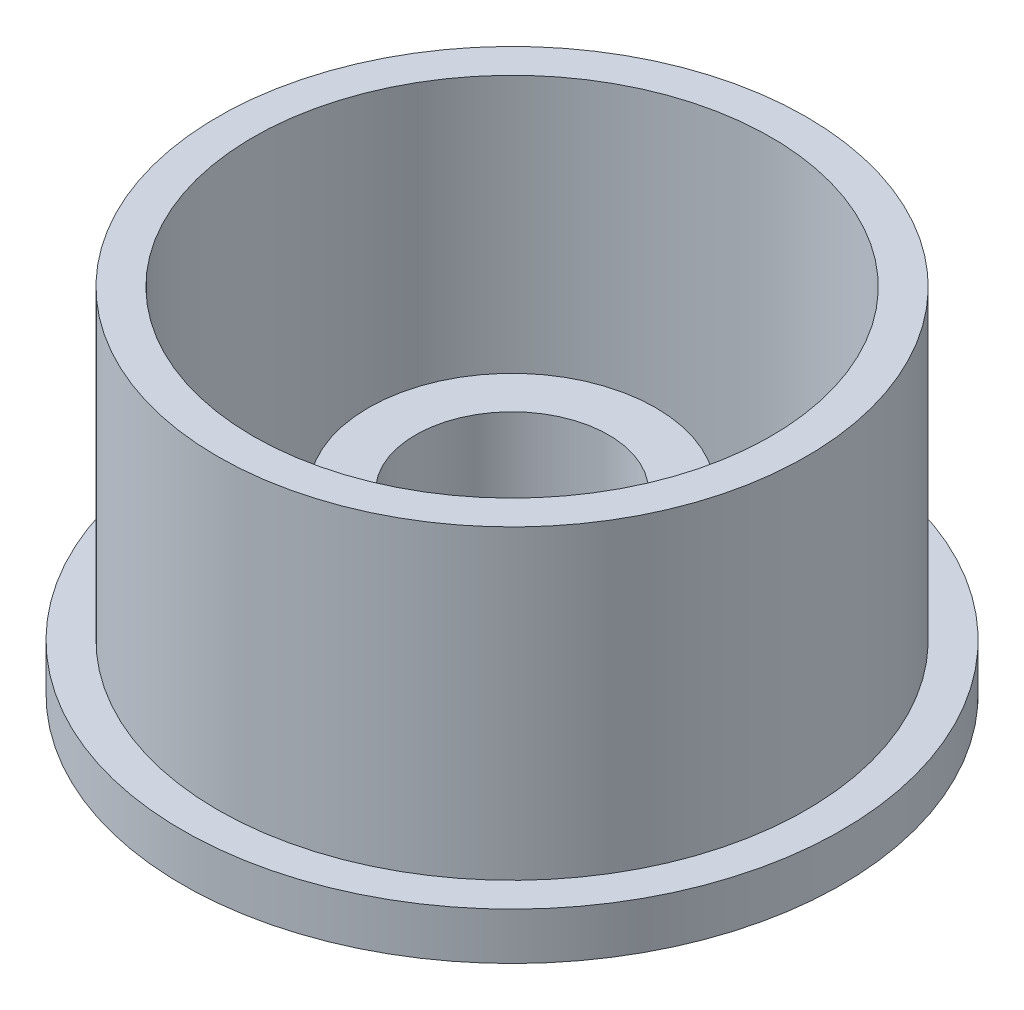
ISO-10303-21;
HEADER;
FILE_DESCRIPTION(('STEP AP214'),'2;1');
FILE_NAME('part.step','',(''),(''),'','','');
FILE_SCHEMA(('AUTOMOTIVE_DESIGN { 1 0 10303 214 1 1 1 1 }'));
ENDSEC;
DATA;
#1=APPLICATION_CONTEXT('core data for automotive mechanical design processes');
#2=APPLICATION_PROTOCOL_DEFINITION('international standard','automotive_design',2000,#1);
#3=PRODUCT_CONTEXT('',#1,'mechanical');
#4=PRODUCT('Part','Part','',(#3));
#5=PRODUCT_RELATED_PRODUCT_CATEGORY('part','',(#4));
#6=PRODUCT_DEFINITION_FORMATION('','',#4);
#7=PRODUCT_DEFINITION_CONTEXT('part definition',#1,'design');
#8=PRODUCT_DEFINITION('design','',#6,#7);
#9=PRODUCT_DEFINITION_SHAPE('','',#8);
#10=(LENGTH_UNIT() NAMED_UNIT(*) SI_UNIT(.MILLI.,.METRE.));
#11=(NAMED_UNIT(*) PLANE_ANGLE_UNIT() SI_UNIT($,.RADIAN.));
#12=(NAMED_UNIT(*) SI_UNIT($,.STERADIAN.) SOLID_ANGLE_UNIT());
#13=UNCERTAINTY_MEASURE_WITH_UNIT(LENGTH_MEASURE(1.E-05),#10,'distance_accuracy_value','');
#14=(GEOMETRIC_REPRESENTATION_CONTEXT(3) GLOBAL_UNCERTAINTY_ASSIGNED_CONTEXT((#13)) GLOBAL_UNIT_ASSIGNED_CONTEXT((#10,
#11,#12)) REPRESENTATION_CONTEXT('',''));
#15=CARTESIAN_POINT('',(0.,0.,0.));
#16=DIRECTION('',(0.,0.,1.));
#17=DIRECTION('',(1.,0.,0.));
#18=AXIS2_PLACEMENT_3D('',#15,#16,#17);
#19=CARTESIAN_POINT('',(0.,15.,0.));
#20=DIRECTION('',(0.,-1.,0.));
#21=DIRECTION('',(0.,0.,-1.));
#22=AXIS2_PLACEMENT_3D('',#19,#20,#21);
#23=CYLINDRICAL_SURFACE('',#22,12.5);
#24=CARTESIAN_POINT('',(0.,15.,0.));
#25=DIRECTION('',(0.,1.,0.));
#26=DIRECTION('',(0.,0.,1.));
#27=AXIS2_PLACEMENT_3D('',#24,#25,#26);
#28=CIRCLE('',#27,12.5);
#29=CARTESIAN_POINT('',(0.,15.,12.5));
#30=VERTEX_POINT('',#29);
#31=EDGE_CURVE('E45',#30,#30,#28,.T.);
#32=ORIENTED_EDGE('',*,*,#31,.F.);
#33=EDGE_LOOP('',(#32));
#34=FACE_BOUND('',#33,.T.);
#35=CARTESIAN_POINT('',(0.,2.,0.));
#36=DIRECTION('',(0.,-1.,0.));
#37=DIRECTION('',(0.,0.,-1.));
#38=AXIS2_PLACEMENT_3D('',#35,#36,#37);
#39=CIRCLE('',#38,12.5);
#40=CARTESIAN_POINT('',(0.,2.,-12.5));
#41=VERTEX_POINT('',#40);
#42=EDGE_CURVE('E11',#41,#41,#39,.T.);
#43=ORIENTED_EDGE('',*,*,#42,.F.);
#44=EDGE_LOOP('',(#43));
#45=FACE_BOUND('',#44,.T.);
#46=ADVANCED_FACE('F39',(#34,#45),#23,.T.);
#47=CARTESIAN_POINT('',(0.,1.5,0.));
#48=DIRECTION('',(0.,1.,0.));
#49=DIRECTION('',(0.,0.,1.));
#50=AXIS2_PLACEMENT_3D('',#47,#48,#49);
#51=PLANE('',#50);
#52=CARTESIAN_POINT('',(0.,1.5,0.));
#53=DIRECTION('',(0.,1.,0.));
#54=DIRECTION('',(0.,0.,1.));
#55=AXIS2_PLACEMENT_3D('',#52,#53,#54);
#56=CIRCLE('',#55,11.);
#57=CARTESIAN_POINT('',(0.,1.5,11.));
#58=VERTEX_POINT('',#57);
#59=EDGE_CURVE('E54',#58,#58,#56,.T.);
#60=ORIENTED_EDGE('',*,*,#59,.T.);
#61=EDGE_LOOP('',(#60));
#62=FACE_BOUND('',#61,.T.);
#63=CARTESIAN_POINT('',(0.,1.5,0.));
#64=DIRECTION('',(0.,1.,0.));
#65=DIRECTION('',(0.,0.,1.));
#66=AXIS2_PLACEMENT_3D('',#63,#64,#65);
#67=CIRCLE('',#66,6.1);
#68=CARTESIAN_POINT('',(0.,1.5,-6.1));
#69=VERTEX_POINT('',#68);
#70=EDGE_CURVE('E64',#69,#69,#67,.T.);
#71=ORIENTED_EDGE('',*,*,#70,.F.);
#72=EDGE_LOOP('',(#71));
#73=FACE_BOUND('',#72,.T.);
#74=ADVANCED_FACE('F101',(#62,#73),#51,.T.);
#75=CARTESIAN_POINT('',(0.,15.,0.));
#76=DIRECTION('',(0.,1.,0.));
#77=DIRECTION('',(0.,0.,1.));
#78=AXIS2_PLACEMENT_3D('',#75,#76,#77);
#79=PLANE('',#78);
#80=CARTESIAN_POINT('',(0.,15.,0.));
#81=DIRECTION('',(0.,1.,0.));
#82=DIRECTION('',(0.,0.,1.));
#83=AXIS2_PLACEMENT_3D('',#80,#81,#82);
#84=CIRCLE('',#83,11.);
#85=CARTESIAN_POINT('',(0.,15.,11.));
#86=VERTEX_POINT('',#85);
#87=EDGE_CURVE('E49',#86,#86,#84,.T.);
#88=ORIENTED_EDGE('',*,*,#87,.F.);
#89=EDGE_LOOP('',(#88));
#90=FACE_BOUND('',#89,.T.);
#91=ORIENTED_EDGE('',*,*,#31,.T.);
#92=EDGE_LOOP('',(#91));
#93=FACE_BOUND('',#92,.T.);
#94=ADVANCED_FACE('F106',(#90,#93),#79,.T.);
#95=CARTESIAN_POINT('',(0.,0.,0.));
#96=DIRECTION('',(0.,1.,0.));
#97=DIRECTION('',(0.,0.,1.));
#98=AXIS2_PLACEMENT_3D('',#95,#96,#97);
#99=PLANE('',#98);
#100=CARTESIAN_POINT('',(0.,0.,0.));
#101=DIRECTION('',(0.,1.,0.));
#102=DIRECTION('',(0.,0.,1.));
#103=AXIS2_PLACEMENT_3D('',#100,#101,#102);
#104=CIRCLE('',#103,4.1);
#105=CARTESIAN_POINT('',(0.,0.,4.1));
#106=VERTEX_POINT('',#105);
#107=EDGE_CURVE('E57',#106,#106,#104,.T.);
#108=ORIENTED_EDGE('',*,*,#107,.T.);
#109=EDGE_LOOP('',(#108));
#110=FACE_BOUND('',#109,.T.);
#111=CARTESIAN_POINT('',(0.,0.,0.));
#112=DIRECTION('',(0.,-1.,0.));
#113=DIRECTION('',(0.,0.,-1.));
#114=AXIS2_PLACEMENT_3D('',#111,#112,#113);
#115=CIRCLE('',#114,14.);
#116=CARTESIAN_POINT('',(0.,0.,-14.));
#117=VERTEX_POINT('',#116);
#118=EDGE_CURVE('E72',#117,#117,#115,.T.);
#119=ORIENTED_EDGE('',*,*,#118,.T.);
#120=EDGE_LOOP('',(#119));
#121=FACE_BOUND('',#120,.T.);
#122=ADVANCED_FACE('F85',(#110,#121),#99,.F.);
#123=CARTESIAN_POINT('',(0.,15.,0.));
#124=DIRECTION('',(0.,-1.,0.));
#125=DIRECTION('',(0.,0.,-1.));
#126=AXIS2_PLACEMENT_3D('',#123,#124,#125);
#127=CYLINDRICAL_SURFACE('',#126,11.);
#128=ORIENTED_EDGE('',*,*,#87,.T.);
#129=EDGE_LOOP('',(#128));
#130=FACE_BOUND('',#129,.T.);
#131=ORIENTED_EDGE('',*,*,#59,.F.);
#132=EDGE_LOOP('',(#131));
#133=FACE_BOUND('',#132,.T.);
#134=ADVANCED_FACE('F117',(#130,#133),#127,.F.);
#135=CARTESIAN_POINT('',(0.,-18.5,0.));
#136=DIRECTION('',(0.,1.,0.));
#137=DIRECTION('',(0.,0.,1.));
#138=AXIS2_PLACEMENT_3D('',#135,#136,#137);
#139=CYLINDRICAL_SURFACE('',#138,4.1);
#140=ORIENTED_EDGE('',*,*,#107,.F.);
#141=EDGE_LOOP('',(#140));
#142=FACE_BOUND('',#141,.T.);
#143=CARTESIAN_POINT('',(0.,7.5,0.));
#144=DIRECTION('',(0.,1.,0.));
#145=DIRECTION('',(0.,0.,1.));
#146=AXIS2_PLACEMENT_3D('',#143,#144,#145);
#147=CIRCLE('',#146,4.1);
#148=CARTESIAN_POINT('',(0.,7.5,4.1));
#149=VERTEX_POINT('',#148);
#150=EDGE_CURVE('E69',#149,#149,#147,.T.);
#151=ORIENTED_EDGE('',*,*,#150,.T.);
#152=EDGE_LOOP('',(#151));
#153=FACE_BOUND('',#152,.T.);
#154=ADVANCED_FACE('F123',(#142,#153),#139,.F.);
#155=CARTESIAN_POINT('',(0.,32.2534054609518,0.));
#156=DIRECTION('',(0.,-1.,0.));
#157=DIRECTION('',(0.,0.,-1.));
#158=AXIS2_PLACEMENT_3D('',#155,#156,#157);
#159=CYLINDRICAL_SURFACE('',#158,6.1);
#160=CARTESIAN_POINT('',(0.,7.5,0.));
#161=DIRECTION('',(0.,1.,0.));
#162=DIRECTION('',(0.,0.,1.));
#163=AXIS2_PLACEMENT_3D('',#160,#161,#162);
#164=CIRCLE('',#163,6.1);
#165=CARTESIAN_POINT('',(0.,7.5,-6.1));
#166=VERTEX_POINT('',#165);
#167=EDGE_CURVE('E59',#166,#166,#164,.T.);
#168=CARTESIAN_POINT('',(0.,1.5,-6.1));
#169=CARTESIAN_POINT('',(0.,1.5625,-6.1));
#170=CARTESIAN_POINT('',(0.,1.625,-6.1));
#171=CARTESIAN_POINT('',(0.,1.75,-6.1));
#172=CARTESIAN_POINT('',(0.,1.8125,-6.1));
#173=CARTESIAN_POINT('',(0.,1.9375,-6.1));
#174=CARTESIAN_POINT('',(0.,2.,-6.1));
#175=CARTESIAN_POINT('',(0.,2.125,-6.1));
#176=CARTESIAN_POINT('',(0.,2.1875,-6.1));
#177=CARTESIAN_POINT('',(0.,2.3125,-6.1));
#178=CARTESIAN_POINT('',(0.,2.375,-6.1));
#179=CARTESIAN_POINT('',(0.,2.5,-6.1));
#180=CARTESIAN_POINT('',(0.,2.5625,-6.1));
#181=CARTESIAN_POINT('',(0.,2.6875,-6.1));
#182=CARTESIAN_POINT('',(0.,2.75,-6.1));
#183=CARTESIAN_POINT('',(0.,2.875,-6.1));
#184=CARTESIAN_POINT('',(0.,2.9375,-6.1));
#185=CARTESIAN_POINT('',(0.,3.0625,-6.1));
#186=CARTESIAN_POINT('',(0.,3.125,-6.1));
#187=CARTESIAN_POINT('',(0.,3.25,-6.1));
#188=CARTESIAN_POINT('',(0.,3.3125,-6.1));
#189=CARTESIAN_POINT('',(0.,3.4375,-6.1));
#190=CARTESIAN_POINT('',(0.,3.5,-6.1));
#191=CARTESIAN_POINT('',(0.,3.625,-6.1));
#192=CARTESIAN_POINT('',(0.,3.6875,-6.1));
#193=CARTESIAN_POINT('',(0.,3.8125,-6.1));
#194=CARTESIAN_POINT('',(0.,3.875,-6.1));
#195=CARTESIAN_POINT('',(0.,4.,-6.1));
#196=CARTESIAN_POINT('',(0.,4.0625,-6.1));
#197=CARTESIAN_POINT('',(0.,4.1875,-6.1));
#198=CARTESIAN_POINT('',(0.,4.25,-6.1));
#199=CARTESIAN_POINT('',(0.,4.375,-6.1));
#200=CARTESIAN_POINT('',(0.,4.4375,-6.1));
#201=CARTESIAN_POINT('',(0.,4.5625,-6.1));
#202=CARTESIAN_POINT('',(0.,4.625,-6.1));
#203=CARTESIAN_POINT('',(0.,4.75,-6.1));
#204=CARTESIAN_POINT('',(0.,4.8125,-6.1));
#205=CARTESIAN_POINT('',(0.,4.9375,-6.1));
#206=CARTESIAN_POINT('',(0.,5.,-6.1));
#207=CARTESIAN_POINT('',(0.,5.125,-6.1));
#208=CARTESIAN_POINT('',(0.,5.1875,-6.1));
#209=CARTESIAN_POINT('',(0.,5.3125,-6.1));
#210=CARTESIAN_POINT('',(0.,5.375,-6.1));
#211=CARTESIAN_POINT('',(0.,5.5,-6.1));
#212=CARTESIAN_POINT('',(0.,5.5625,-6.1));
#213=CARTESIAN_POINT('',(0.,5.68749999999999,-6.1));
#214=CARTESIAN_POINT('',(0.,5.74999999999999,-6.1));
#215=CARTESIAN_POINT('',(0.,5.87499999999999,-6.1));
#216=CARTESIAN_POINT('',(0.,5.93749999999999,-6.1));
#217=CARTESIAN_POINT('',(0.,6.06249999999999,-6.1));
#218=CARTESIAN_POINT('',(0.,6.12499999999999,-6.1));
#219=CARTESIAN_POINT('',(0.,6.25,-6.1));
#220=CARTESIAN_POINT('',(0.,6.3125,-6.1));
#221=CARTESIAN_POINT('',(0.,6.4375,-6.1));
#222=CARTESIAN_POINT('',(0.,6.5,-6.1));
#223=CARTESIAN_POINT('',(0.,6.625,-6.1));
#224=CARTESIAN_POINT('',(0.,6.6875,-6.1));
#225=CARTESIAN_POINT('',(0.,6.8125,-6.1));
#226=CARTESIAN_POINT('',(0.,6.875,-6.1));
#227=CARTESIAN_POINT('',(0.,7.,-6.1));
#228=CARTESIAN_POINT('',(0.,7.0625,-6.1));
#229=CARTESIAN_POINT('',(0.,7.1875,-6.1));
#230=CARTESIAN_POINT('',(0.,7.25,-6.1));
#231=CARTESIAN_POINT('',(0.,7.375,-6.1));
#232=CARTESIAN_POINT('',(0.,7.4375,-6.1));
#233=CARTESIAN_POINT('',(0.,7.5,-6.1));
#234=B_SPLINE_CURVE_WITH_KNOTS('',3,(#168,#169,#170,#171,#172,#173,#174,#175,#176,#177,#178,
#179,#180,#181,#182,#183,#184,#185,#186,#187,#188,#189,#190,#191,#192,#193,#194,#195,#196,#197,
#198,#199,#200,#201,#202,#203,#204,#205,#206,#207,#208,#209,#210,#211,#212,#213,#214,#215,#216,
#217,#218,#219,#220,#221,#222,#223,#224,#225,#226,#227,#228,#229,#230,#231,#232,#233),
.UNSPECIFIED.,.F.,.F.,(4,2,2,2,2,2,2,2,2,2,2,2,2,2,2,2,2,2,2,2,2,2,2,2,2,2,2,2,2,2,2,2,4),(0.,
0.1875,0.375,0.5625,0.750000000000001,0.937500000000001,1.125,1.3125,1.5,1.6875,1.875,2.0625,
2.25,2.4375,2.625,2.8125,3.,3.1875,3.375,3.5625,3.75,3.9375,4.125,4.3125,4.5,4.6875,4.875,
5.0625,5.25,5.4375,5.625,5.8125,6.),.UNSPECIFIED.);
#235=EDGE_CURVE('BSEAM97',#69,#166,#234,.T.);
#236=ORIENTED_EDGE('',*,*,#70,.T.);
#237=ORIENTED_EDGE('',*,*,#167,.F.);
#238=ORIENTED_EDGE('',*,*,#235,.T.);
#239=ORIENTED_EDGE('',*,*,#235,.F.);
#240=EDGE_LOOP('',(#236,#238,#237,#239));
#241=FACE_BOUND('',#240,.T.);
#242=ADVANCED_FACE('F97',(#241),#159,.T.);
#243=CARTESIAN_POINT('',(0.,7.5,0.));
#244=DIRECTION('',(0.,1.,0.));
#245=DIRECTION('',(0.,0.,1.));
#246=AXIS2_PLACEMENT_3D('',#243,#244,#245);
#247=PLANE('',#246);
#248=ORIENTED_EDGE('',*,*,#150,.F.);
#249=EDGE_LOOP('',(#248));
#250=FACE_BOUND('',#249,.T.);
#251=ORIENTED_EDGE('',*,*,#167,.T.);
#252=EDGE_LOOP('',(#251));
#253=FACE_BOUND('',#252,.T.);
#254=ADVANCED_FACE('F90',(#250,#253),#247,.T.);
#255=CARTESIAN_POINT('',(0.,2.,0.));
#256=DIRECTION('',(0.,-1.,0.));
#257=DIRECTION('',(0.,0.,-1.));
#258=AXIS2_PLACEMENT_3D('',#255,#256,#257);
#259=CYLINDRICAL_SURFACE('',#258,14.);
#260=CARTESIAN_POINT('',(0.,2.,0.));
#261=DIRECTION('',(0.,-1.,0.));
#262=DIRECTION('',(0.,0.,-1.));
#263=AXIS2_PLACEMENT_3D('',#260,#261,#262);
#264=CIRCLE('',#263,14.);
#265=CARTESIAN_POINT('',(0.,2.,-14.));
#266=VERTEX_POINT('',#265);
#267=EDGE_CURVE('E76',#266,#266,#264,.T.);
#268=ORIENTED_EDGE('',*,*,#267,.T.);
#269=EDGE_LOOP('',(#268));
#270=FACE_BOUND('',#269,.T.);
#271=ORIENTED_EDGE('',*,*,#118,.F.);
#272=EDGE_LOOP('',(#271));
#273=FACE_BOUND('',#272,.T.);
#274=ADVANCED_FACE('F87',(#270,#273),#259,.T.);
#275=CARTESIAN_POINT('',(0.,2.,0.));
#276=DIRECTION('',(0.,-1.,0.));
#277=DIRECTION('',(0.,0.,-1.));
#278=AXIS2_PLACEMENT_3D('',#275,#276,#277);
#279=PLANE('',#278);
#280=ORIENTED_EDGE('',*,*,#42,.T.);
#281=EDGE_LOOP('',(#280));
#282=FACE_BOUND('',#281,.T.);
#283=ORIENTED_EDGE('',*,*,#267,.F.);
#284=EDGE_LOOP('',(#283));
#285=FACE_BOUND('',#284,.T.);
#286=ADVANCED_FACE('F89',(#282,#285),#279,.F.);
#287=CLOSED_SHELL('',(#46,#74,#94,#122,#134,#154,#242,#254,#274,#286));
#288=MANIFOLD_SOLID_BREP('B2',#287);
#289=ADVANCED_BREP_SHAPE_REPRESENTATION('',(#18,#288),#14);
#290=SHAPE_DEFINITION_REPRESENTATION(#9,#289);
ENDSEC;
END-ISO-10303-21;
